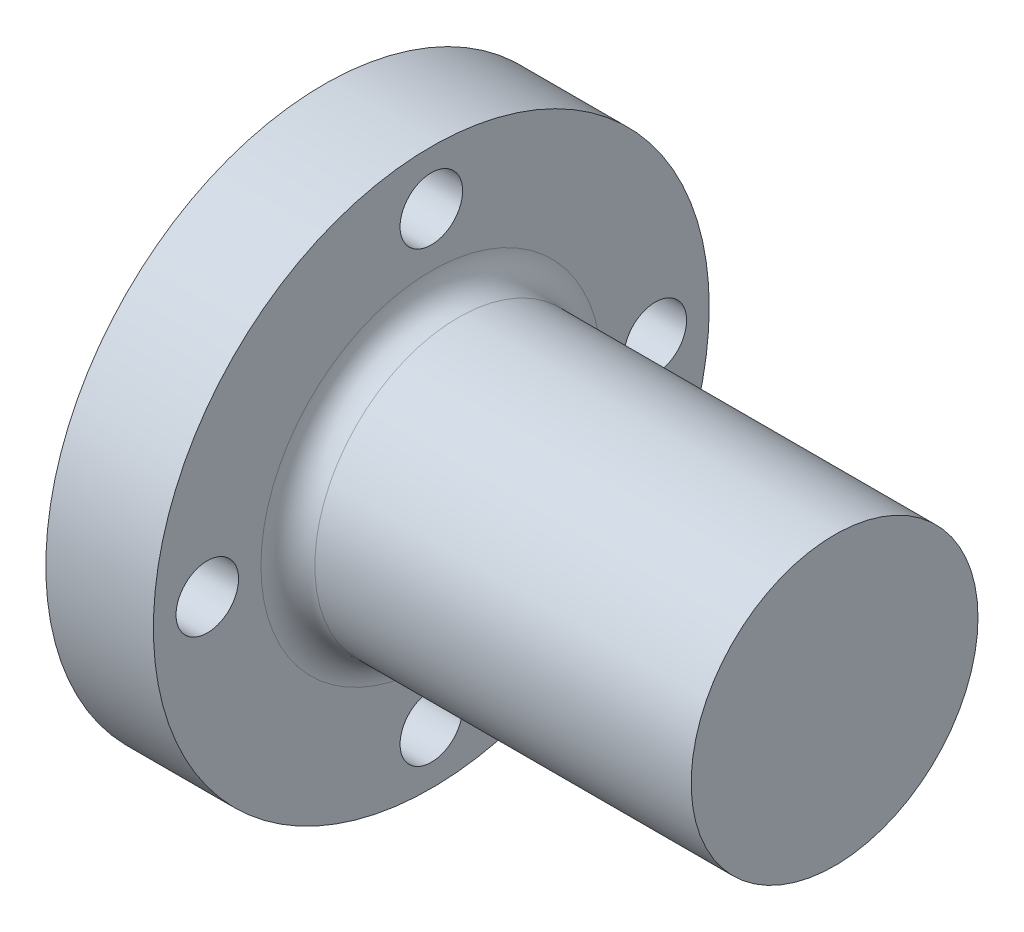
ISO-10303-21;
HEADER;
FILE_DESCRIPTION(('STEP AP214'),'2;1');
FILE_NAME('part.step','',(''),(''),'','','');
FILE_SCHEMA(('AUTOMOTIVE_DESIGN { 1 0 10303 214 1 1 1 1 }'));
ENDSEC;
DATA;
#1=APPLICATION_CONTEXT('core data for automotive mechanical design processes');
#2=APPLICATION_PROTOCOL_DEFINITION('international standard','automotive_design',2000,#1);
#3=PRODUCT_CONTEXT('',#1,'mechanical');
#4=PRODUCT('Part','Part','',(#3));
#5=PRODUCT_RELATED_PRODUCT_CATEGORY('part','',(#4));
#6=PRODUCT_DEFINITION_FORMATION('','',#4);
#7=PRODUCT_DEFINITION_CONTEXT('part definition',#1,'design');
#8=PRODUCT_DEFINITION('design','',#6,#7);
#9=PRODUCT_DEFINITION_SHAPE('','',#8);
#10=(LENGTH_UNIT() NAMED_UNIT(*) SI_UNIT(.MILLI.,.METRE.));
#11=(NAMED_UNIT(*) PLANE_ANGLE_UNIT() SI_UNIT($,.RADIAN.));
#12=(NAMED_UNIT(*) SI_UNIT($,.STERADIAN.) SOLID_ANGLE_UNIT());
#13=UNCERTAINTY_MEASURE_WITH_UNIT(LENGTH_MEASURE(1.E-05),#10,'distance_accuracy_value','');
#14=(GEOMETRIC_REPRESENTATION_CONTEXT(3) GLOBAL_UNCERTAINTY_ASSIGNED_CONTEXT((#13)) GLOBAL_UNIT_ASSIGNED_CONTEXT((#10,
#11,#12)) REPRESENTATION_CONTEXT('',''));
#15=CARTESIAN_POINT('',(0.,0.,0.));
#16=DIRECTION('',(0.,0.,1.));
#17=DIRECTION('',(1.,0.,0.));
#18=AXIS2_PLACEMENT_3D('',#15,#16,#17);
#19=CARTESIAN_POINT('',(9.525,0.,0.));
#20=DIRECTION('',(-1.,0.,0.));
#21=DIRECTION('',(0.,0.,1.));
#22=AXIS2_PLACEMENT_3D('',#19,#20,#21);
#23=CYLINDRICAL_SURFACE('',#22,24.6126);
#24=CARTESIAN_POINT('',(9.525,0.,0.));
#25=DIRECTION('',(1.,0.,0.));
#26=DIRECTION('',(0.,0.,-1.));
#27=AXIS2_PLACEMENT_3D('',#24,#25,#26);
#28=CIRCLE('',#27,24.6126);
#29=CARTESIAN_POINT('',(9.525,0.,-24.6126));
#30=VERTEX_POINT('',#29);
#31=EDGE_CURVE('E59',#30,#30,#28,.T.);
#32=ORIENTED_EDGE('',*,*,#31,.F.);
#33=EDGE_LOOP('',(#32));
#34=FACE_BOUND('',#33,.T.);
#35=CARTESIAN_POINT('',(0.,0.,0.));
#36=DIRECTION('',(1.,0.,0.));
#37=DIRECTION('',(0.,0.,-1.));
#38=AXIS2_PLACEMENT_3D('',#35,#36,#37);
#39=CIRCLE('',#38,24.6126);
#40=CARTESIAN_POINT('',(0.,0.,-24.6126));
#41=VERTEX_POINT('',#40);
#42=EDGE_CURVE('E60',#41,#41,#39,.T.);
#43=ORIENTED_EDGE('',*,*,#42,.T.);
#44=EDGE_LOOP('',(#43));
#45=FACE_BOUND('',#44,.T.);
#46=ADVANCED_FACE('F39',(#34,#45),#23,.T.);
#47=CARTESIAN_POINT('',(9.525,0.,0.));
#48=DIRECTION('',(1.,0.,0.));
#49=DIRECTION('',(0.,0.,-1.));
#50=AXIS2_PLACEMENT_3D('',#47,#48,#49);
#51=PLANE('',#50);
#52=CARTESIAN_POINT('',(9.525,0.,0.));
#53=DIRECTION('',(1.,0.,0.));
#54=DIRECTION('',(0.,0.,-1.));
#55=AXIS2_PLACEMENT_3D('',#52,#53,#54);
#56=CIRCLE('',#55,15.0876);
#57=CARTESIAN_POINT('',(9.525,0.,-15.0876));
#58=VERTEX_POINT('',#57);
#59=EDGE_CURVE('E10',#58,#58,#56,.F.);
#60=ORIENTED_EDGE('',*,*,#59,.T.);
#61=EDGE_LOOP('',(#60));
#62=FACE_BOUND('',#61,.T.);
#63=CARTESIAN_POINT('',(9.525,0.,19.8374));
#64=DIRECTION('',(1.,0.,0.));
#65=DIRECTION('',(0.,0.,-1.));
#66=AXIS2_PLACEMENT_3D('',#63,#64,#65);
#67=CIRCLE('',#66,2.7686);
#68=CARTESIAN_POINT('',(9.525,0.,17.0688));
#69=VERTEX_POINT('',#68);
#70=EDGE_CURVE('E71',#69,#69,#67,.F.);
#71=ORIENTED_EDGE('',*,*,#70,.T.);
#72=EDGE_LOOP('',(#71));
#73=FACE_BOUND('',#72,.T.);
#74=CARTESIAN_POINT('',(9.525,19.8374,0.));
#75=DIRECTION('',(1.,0.,0.));
#76=DIRECTION('',(0.,0.,-1.));
#77=AXIS2_PLACEMENT_3D('',#74,#75,#76);
#78=CIRCLE('',#77,2.7686);
#79=CARTESIAN_POINT('',(9.525,19.8374,-2.7686));
#80=VERTEX_POINT('',#79);
#81=EDGE_CURVE('E74',#80,#80,#78,.F.);
#82=ORIENTED_EDGE('',*,*,#81,.T.);
#83=EDGE_LOOP('',(#82));
#84=FACE_BOUND('',#83,.T.);
#85=CARTESIAN_POINT('',(9.525,0.,-19.8374));
#86=DIRECTION('',(1.,0.,0.));
#87=DIRECTION('',(0.,0.,-1.));
#88=AXIS2_PLACEMENT_3D('',#85,#86,#87);
#89=CIRCLE('',#88,2.7686);
#90=CARTESIAN_POINT('',(9.525,0.,-22.606));
#91=VERTEX_POINT('',#90);
#92=EDGE_CURVE('E77',#91,#91,#89,.F.);
#93=ORIENTED_EDGE('',*,*,#92,.T.);
#94=EDGE_LOOP('',(#93));
#95=FACE_BOUND('',#94,.T.);
#96=CARTESIAN_POINT('',(9.525,-19.8374,0.));
#97=DIRECTION('',(1.,0.,0.));
#98=DIRECTION('',(0.,0.,-1.));
#99=AXIS2_PLACEMENT_3D('',#96,#97,#98);
#100=CIRCLE('',#99,2.7686);
#101=CARTESIAN_POINT('',(9.525,-19.8374,-2.7686));
#102=VERTEX_POINT('',#101);
#103=EDGE_CURVE('E80',#102,#102,#100,.F.);
#104=ORIENTED_EDGE('',*,*,#103,.T.);
#105=EDGE_LOOP('',(#104));
#106=FACE_BOUND('',#105,.T.);
#107=ORIENTED_EDGE('',*,*,#31,.T.);
#108=EDGE_LOOP('',(#107));
#109=FACE_BOUND('',#108,.T.);
#110=ADVANCED_FACE('F116',(#62,#73,#84,#95,#106,#109),#51,.T.);
#111=CARTESIAN_POINT('',(0.,0.,0.));
#112=DIRECTION('',(1.,0.,0.));
#113=DIRECTION('',(0.,0.,-1.));
#114=AXIS2_PLACEMENT_3D('',#111,#112,#113);
#115=PLANE('',#114);
#116=CARTESIAN_POINT('',(0.,0.,0.));
#117=DIRECTION('',(1.,0.,0.));
#118=DIRECTION('',(0.,0.,-1.));
#119=AXIS2_PLACEMENT_3D('',#116,#117,#118);
#120=CIRCLE('',#119,9.0932);
#121=CARTESIAN_POINT('',(0.,0.,-9.0932));
#122=VERTEX_POINT('',#121);
#123=EDGE_CURVE('E54',#122,#122,#120,.T.);
#124=ORIENTED_EDGE('',*,*,#123,.T.);
#125=EDGE_LOOP('',(#124));
#126=FACE_BOUND('',#125,.T.);
#127=CARTESIAN_POINT('',(0.,0.,19.8374));
#128=DIRECTION('',(1.,0.,0.));
#129=DIRECTION('',(0.,0.,-1.));
#130=AXIS2_PLACEMENT_3D('',#127,#128,#129);
#131=CIRCLE('',#130,2.7686);
#132=CARTESIAN_POINT('',(0.,0.,17.0688));
#133=VERTEX_POINT('',#132);
#134=EDGE_CURVE('E83',#133,#133,#131,.T.);
#135=ORIENTED_EDGE('',*,*,#134,.T.);
#136=EDGE_LOOP('',(#135));
#137=FACE_BOUND('',#136,.T.);
#138=CARTESIAN_POINT('',(0.,19.8374,0.));
#139=DIRECTION('',(1.,0.,0.));
#140=DIRECTION('',(0.,0.,-1.));
#141=AXIS2_PLACEMENT_3D('',#138,#139,#140);
#142=CIRCLE('',#141,2.7686);
#143=CARTESIAN_POINT('',(0.,19.8374,-2.7686));
#144=VERTEX_POINT('',#143);
#145=EDGE_CURVE('E90',#144,#144,#142,.T.);
#146=ORIENTED_EDGE('',*,*,#145,.T.);
#147=EDGE_LOOP('',(#146));
#148=FACE_BOUND('',#147,.T.);
#149=CARTESIAN_POINT('',(0.,0.,-19.8374));
#150=DIRECTION('',(1.,0.,0.));
#151=DIRECTION('',(0.,0.,-1.));
#152=AXIS2_PLACEMENT_3D('',#149,#150,#151);
#153=CIRCLE('',#152,2.7686);
#154=CARTESIAN_POINT('',(0.,0.,-22.606));
#155=VERTEX_POINT('',#154);
#156=EDGE_CURVE('E87',#155,#155,#153,.T.);
#157=ORIENTED_EDGE('',*,*,#156,.T.);
#158=EDGE_LOOP('',(#157));
#159=FACE_BOUND('',#158,.T.);
#160=CARTESIAN_POINT('',(0.,-19.8374,0.));
#161=DIRECTION('',(1.,0.,0.));
#162=DIRECTION('',(0.,0.,-1.));
#163=AXIS2_PLACEMENT_3D('',#160,#161,#162);
#164=CIRCLE('',#163,2.7686);
#165=CARTESIAN_POINT('',(0.,-19.8374,-2.7686));
#166=VERTEX_POINT('',#165);
#167=EDGE_CURVE('E84',#166,#166,#164,.T.);
#168=ORIENTED_EDGE('',*,*,#167,.T.);
#169=EDGE_LOOP('',(#168));
#170=FACE_BOUND('',#169,.T.);
#171=ORIENTED_EDGE('',*,*,#42,.F.);
#172=EDGE_LOOP('',(#171));
#173=FACE_BOUND('',#172,.T.);
#174=ADVANCED_FACE('F96',(#126,#137,#148,#159,#170,#173),#115,.F.);
#175=CARTESIAN_POINT('',(45.2374,0.,0.));
#176=DIRECTION('',(-1.,0.,0.));
#177=DIRECTION('',(0.,0.,1.));
#178=AXIS2_PLACEMENT_3D('',#175,#176,#177);
#179=CYLINDRICAL_SURFACE('',#178,12.7);
#180=CARTESIAN_POINT('',(11.9126,0.,0.));
#181=DIRECTION('',(1.,0.,0.));
#182=DIRECTION('',(0.,0.,-1.));
#183=AXIS2_PLACEMENT_3D('',#180,#181,#182);
#184=CIRCLE('',#183,12.7);
#185=CARTESIAN_POINT('',(11.9126,0.,-12.7));
#186=VERTEX_POINT('',#185);
#187=EDGE_CURVE('E46',#186,#186,#184,.T.);
#188=ORIENTED_EDGE('',*,*,#187,.T.);
#189=EDGE_LOOP('',(#188));
#190=FACE_BOUND('',#189,.T.);
#191=CARTESIAN_POINT('',(45.2374,0.,0.));
#192=DIRECTION('',(1.,0.,0.));
#193=DIRECTION('',(0.,0.,-1.));
#194=AXIS2_PLACEMENT_3D('',#191,#192,#193);
#195=CIRCLE('',#194,12.7);
#196=CARTESIAN_POINT('',(45.2374,0.,-12.7));
#197=VERTEX_POINT('',#196);
#198=EDGE_CURVE('E63',#197,#197,#195,.T.);
#199=ORIENTED_EDGE('',*,*,#198,.F.);
#200=EDGE_LOOP('',(#199));
#201=FACE_BOUND('',#200,.T.);
#202=ADVANCED_FACE('F127',(#190,#201),#179,.T.);
#203=CARTESIAN_POINT('',(45.2374,0.,0.));
#204=DIRECTION('',(1.,0.,0.));
#205=DIRECTION('',(0.,0.,-1.));
#206=AXIS2_PLACEMENT_3D('',#203,#204,#205);
#207=PLANE('',#206);
#208=ORIENTED_EDGE('',*,*,#198,.T.);
#209=EDGE_LOOP('',(#208));
#210=FACE_BOUND('',#209,.T.);
#211=ADVANCED_FACE('F132',(#210),#207,.T.);
#212=CARTESIAN_POINT('',(-4.826,0.,0.));
#213=DIRECTION('',(1.,0.,0.));
#214=DIRECTION('',(0.,0.,-1.));
#215=AXIS2_PLACEMENT_3D('',#212,#213,#214);
#216=CYLINDRICAL_SURFACE('',#215,8.7122);
#217=CARTESIAN_POINT('',(-0.381,0.,0.));
#218=DIRECTION('',(1.,0.,0.));
#219=DIRECTION('',(0.,0.,-1.));
#220=AXIS2_PLACEMENT_3D('',#217,#218,#219);
#221=CIRCLE('',#220,8.7122);
#222=CARTESIAN_POINT('',(-0.381,0.,-8.7122));
#223=VERTEX_POINT('',#222);
#224=EDGE_CURVE('E50',#223,#223,#221,.F.);
#225=ORIENTED_EDGE('',*,*,#224,.T.);
#226=EDGE_LOOP('',(#225));
#227=FACE_BOUND('',#226,.T.);
#228=CARTESIAN_POINT('',(-4.826,0.,0.));
#229=DIRECTION('',(1.,0.,0.));
#230=DIRECTION('',(0.,0.,-1.));
#231=AXIS2_PLACEMENT_3D('',#228,#229,#230);
#232=CIRCLE('',#231,8.7122);
#233=CARTESIAN_POINT('',(-4.826,0.,-8.7122));
#234=VERTEX_POINT('',#233);
#235=EDGE_CURVE('E68',#234,#234,#232,.T.);
#236=ORIENTED_EDGE('',*,*,#235,.T.);
#237=EDGE_LOOP('',(#236));
#238=FACE_BOUND('',#237,.T.);
#239=ADVANCED_FACE('F134',(#227,#238),#216,.T.);
#240=CARTESIAN_POINT('',(-4.826,0.,0.));
#241=DIRECTION('',(1.,0.,0.));
#242=DIRECTION('',(0.,0.,-1.));
#243=AXIS2_PLACEMENT_3D('',#240,#241,#242);
#244=PLANE('',#243);
#245=ORIENTED_EDGE('',*,*,#235,.F.);
#246=EDGE_LOOP('',(#245));
#247=FACE_BOUND('',#246,.T.);
#248=ADVANCED_FACE('F138',(#247),#244,.F.);
#249=CARTESIAN_POINT('',(45.2374,-19.8374,0.));
#250=DIRECTION('',(-1.,0.,0.));
#251=DIRECTION('',(0.,0.,1.));
#252=AXIS2_PLACEMENT_3D('',#249,#250,#251);
#253=CYLINDRICAL_SURFACE('',#252,2.7686);
#254=ORIENTED_EDGE('',*,*,#103,.F.);
#255=EDGE_LOOP('',(#254));
#256=FACE_BOUND('',#255,.T.);
#257=ORIENTED_EDGE('',*,*,#167,.F.);
#258=EDGE_LOOP('',(#257));
#259=FACE_BOUND('',#258,.T.);
#260=ADVANCED_FACE('F142',(#256,#259),#253,.F.);
#261=CARTESIAN_POINT('',(45.2374,0.,-19.8374));
#262=DIRECTION('',(-1.,0.,0.));
#263=DIRECTION('',(0.,0.,1.));
#264=AXIS2_PLACEMENT_3D('',#261,#262,#263);
#265=CYLINDRICAL_SURFACE('',#264,2.7686);
#266=ORIENTED_EDGE('',*,*,#92,.F.);
#267=EDGE_LOOP('',(#266));
#268=FACE_BOUND('',#267,.T.);
#269=ORIENTED_EDGE('',*,*,#156,.F.);
#270=EDGE_LOOP('',(#269));
#271=FACE_BOUND('',#270,.T.);
#272=ADVANCED_FACE('F111',(#268,#271),#265,.F.);
#273=CARTESIAN_POINT('',(45.2374,19.8374,0.));
#274=DIRECTION('',(-1.,0.,0.));
#275=DIRECTION('',(0.,0.,1.));
#276=AXIS2_PLACEMENT_3D('',#273,#274,#275);
#277=CYLINDRICAL_SURFACE('',#276,2.7686);
#278=ORIENTED_EDGE('',*,*,#81,.F.);
#279=EDGE_LOOP('',(#278));
#280=FACE_BOUND('',#279,.T.);
#281=ORIENTED_EDGE('',*,*,#145,.F.);
#282=EDGE_LOOP('',(#281));
#283=FACE_BOUND('',#282,.T.);
#284=ADVANCED_FACE('F102',(#280,#283),#277,.F.);
#285=CARTESIAN_POINT('',(45.2374,0.,19.8374));
#286=DIRECTION('',(-1.,0.,0.));
#287=DIRECTION('',(0.,0.,1.));
#288=AXIS2_PLACEMENT_3D('',#285,#286,#287);
#289=CYLINDRICAL_SURFACE('',#288,2.7686);
#290=ORIENTED_EDGE('',*,*,#70,.F.);
#291=EDGE_LOOP('',(#290));
#292=FACE_BOUND('',#291,.T.);
#293=ORIENTED_EDGE('',*,*,#134,.F.);
#294=EDGE_LOOP('',(#293));
#295=FACE_BOUND('',#294,.T.);
#296=ADVANCED_FACE('F99',(#292,#295),#289,.F.);
#297=CARTESIAN_POINT('',(-0.381,0.,0.));
#298=DIRECTION('',(1.,0.,0.));
#299=DIRECTION('',(0.,0.,-1.));
#300=AXIS2_PLACEMENT_3D('',#297,#298,#299);
#301=TOROIDAL_SURFACE('',#300,9.0932,0.381);
#302=ORIENTED_EDGE('',*,*,#224,.F.);
#303=EDGE_LOOP('',(#302));
#304=FACE_BOUND('',#303,.T.);
#305=ORIENTED_EDGE('',*,*,#123,.F.);
#306=EDGE_LOOP('',(#305));
#307=FACE_BOUND('',#306,.T.);
#308=ADVANCED_FACE('F101',(#304,#307),#301,.F.);
#309=CARTESIAN_POINT('',(11.9126,0.,0.));
#310=DIRECTION('',(1.,0.,0.));
#311=DIRECTION('',(0.,0.,-1.));
#312=AXIS2_PLACEMENT_3D('',#309,#310,#311);
#313=TOROIDAL_SURFACE('',#312,15.0876,2.3876);
#314=ORIENTED_EDGE('',*,*,#59,.F.);
#315=EDGE_LOOP('',(#314));
#316=FACE_BOUND('',#315,.T.);
#317=ORIENTED_EDGE('',*,*,#187,.F.);
#318=EDGE_LOOP('',(#317));
#319=FACE_BOUND('',#318,.T.);
#320=ADVANCED_FACE('F41',(#316,#319),#313,.F.);
#321=CLOSED_SHELL('',(#46,#110,#174,#202,#211,#239,#248,#260,#272,#284,#296,#308,#320));
#322=MANIFOLD_SOLID_BREP('B2',#321);
#323=ADVANCED_BREP_SHAPE_REPRESENTATION('',(#18,#322),#14);
#324=SHAPE_DEFINITION_REPRESENTATION(#9,#323);
ENDSEC;
END-ISO-10303-21;
